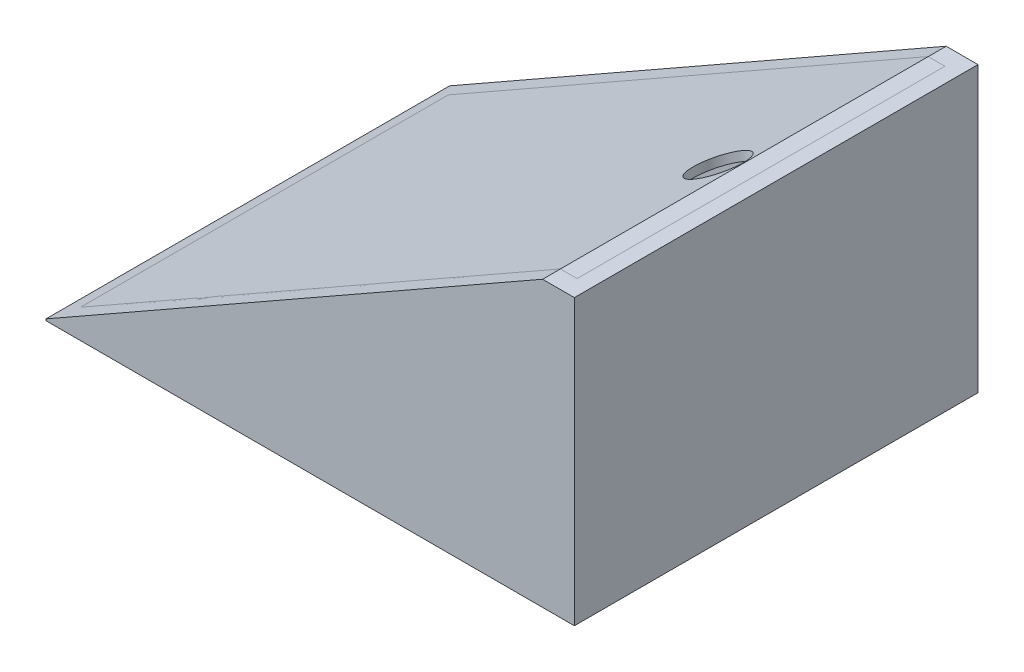
ISO-10303-21;
HEADER;
FILE_DESCRIPTION(('STEP AP214'),'2;1');
FILE_NAME('part.step','',(''),(''),'','','');
FILE_SCHEMA(('AUTOMOTIVE_DESIGN { 1 0 10303 214 1 1 1 1 }'));
ENDSEC;
DATA;
#1=APPLICATION_CONTEXT('core data for automotive mechanical design processes');
#2=APPLICATION_PROTOCOL_DEFINITION('international standard','automotive_design',2000,#1);
#3=PRODUCT_CONTEXT('',#1,'mechanical');
#4=PRODUCT('Part','Part','',(#3));
#5=PRODUCT_RELATED_PRODUCT_CATEGORY('part','',(#4));
#6=PRODUCT_DEFINITION_FORMATION('','',#4);
#7=PRODUCT_DEFINITION_CONTEXT('part definition',#1,'design');
#8=PRODUCT_DEFINITION('design','',#6,#7);
#9=PRODUCT_DEFINITION_SHAPE('','',#8);
#10=(LENGTH_UNIT() NAMED_UNIT(*) SI_UNIT(.MILLI.,.METRE.));
#11=(NAMED_UNIT(*) PLANE_ANGLE_UNIT() SI_UNIT($,.RADIAN.));
#12=(NAMED_UNIT(*) SI_UNIT($,.STERADIAN.) SOLID_ANGLE_UNIT());
#13=UNCERTAINTY_MEASURE_WITH_UNIT(LENGTH_MEASURE(1.E-05),#10,'distance_accuracy_value','');
#14=(GEOMETRIC_REPRESENTATION_CONTEXT(3) GLOBAL_UNCERTAINTY_ASSIGNED_CONTEXT((#13)) GLOBAL_UNIT_ASSIGNED_CONTEXT((#10,
#11,#12)) REPRESENTATION_CONTEXT('',''));
#15=CARTESIAN_POINT('',(0.,0.,0.));
#16=DIRECTION('',(0.,0.,1.));
#17=DIRECTION('',(1.,0.,0.));
#18=AXIS2_PLACEMENT_3D('',#15,#16,#17);
#19=CARTESIAN_POINT('',(-42.4496374602654,0.,70.2103839542302));
#20=DIRECTION('',(1.,0.,0.));
#21=DIRECTION('',(0.,0.,-1.));
#22=AXIS2_PLACEMENT_3D('',#19,#20,#21);
#23=PLANE('',#22);
#24=DIRECTION('',(0.,-1.,0.));
#25=VECTOR('',#24,1.);
#26=CARTESIAN_POINT('',(-42.4496374602654,0.,-10.7896160457699));
#27=LINE('',#26,#25);
#28=CARTESIAN_POINT('',(-42.4496374602654,2.4179577529253,-10.7896160457699));
#29=VERTEX_POINT('',#28);
#30=CARTESIAN_POINT('',(-42.4496374602654,0.,-10.7896160457699));
#31=VERTEX_POINT('',#30);
#32=EDGE_CURVE('E109',#29,#31,#27,.T.);
#33=ORIENTED_EDGE('',*,*,#32,.T.);
#34=DIRECTION('',(0.,0.,-1.));
#35=VECTOR('',#34,1.);
#36=CARTESIAN_POINT('',(-42.4496374602654,0.,70.2103839542302));
#37=LINE('',#36,#35);
#38=CARTESIAN_POINT('',(-42.4496374602654,0.,70.2103839542302));
#39=VERTEX_POINT('',#38);
#40=EDGE_CURVE('E12',#39,#31,#37,.T.);
#41=ORIENTED_EDGE('',*,*,#40,.F.);
#42=DIRECTION('',(0.,-1.,0.));
#43=VECTOR('',#42,1.);
#44=CARTESIAN_POINT('',(-42.4496374602654,0.,70.2103839542302));
#45=LINE('',#44,#43);
#46=CARTESIAN_POINT('',(-42.4496374602654,2.4179577529253,70.2103839542302));
#47=VERTEX_POINT('',#46);
#48=EDGE_CURVE('E96',#47,#39,#45,.T.);
#49=ORIENTED_EDGE('',*,*,#48,.F.);
#50=DIRECTION('',(0.,0.,-1.));
#51=VECTOR('',#50,1.);
#52=CARTESIAN_POINT('',(-42.4496374602654,2.4179577529253,70.2103839542302));
#53=LINE('',#52,#51);
#54=EDGE_CURVE('E105',#47,#29,#53,.T.);
#55=ORIENTED_EDGE('',*,*,#54,.T.);
#56=EDGE_LOOP('',(#33,#41,#49,#55));
#57=FACE_BOUND('',#56,.T.);
#58=ADVANCED_FACE('F44',(#57),#23,.F.);
#59=CARTESIAN_POINT('',(-42.4496374602654,0.,70.2103839542302));
#60=DIRECTION('',(-0.496708290503891,0.867917550314949,0.));
#61=DIRECTION('',(-0.867917550314949,-0.496708290503891,0.));
#62=AXIS2_PLACEMENT_3D('',#59,#60,#61);
#63=PLANE('',#62);
#64=CARTESIAN_POINT('',(56.5043619696953,56.6312685779229,29.3268806032643));
#65=DIRECTION('',(-0.496708290503891,0.867917550314949,0.));
#66=DIRECTION('',(-0.867917550314949,-0.496708290503891,0.));
#67=AXIS2_PLACEMENT_3D('',#64,#65,#66);
#68=ELLIPSE('',#67,6.25432199808688,5.42823582746047);
#69=CARTESIAN_POINT('',(51.0761261422348,53.5246949899922,29.3268806032643));
#70=VERTEX_POINT('',#69);
#71=EDGE_CURVE('E112',#70,#70,#68,.F.);
#72=ORIENTED_EDGE('',*,*,#71,.F.);
#73=EDGE_LOOP('',(#72));
#74=FACE_BOUND('',#73,.T.);
#75=DIRECTION('',(0.867917550314949,0.496708290503891,0.));
#76=VECTOR('',#75,1.);
#77=CARTESIAN_POINT('',(-42.4496374602654,0.,-10.7896160457699));
#78=LINE('',#77,#76);
#79=CARTESIAN_POINT('',(65.8853534152399,62.,-10.7896160457699));
#80=VERTEX_POINT('',#79);
#81=EDGE_CURVE('E100',#31,#80,#78,.T.);
#82=ORIENTED_EDGE('',*,*,#81,.T.);
#83=DIRECTION('',(0.,0.,-1.));
#84=VECTOR('',#83,1.);
#85=CARTESIAN_POINT('',(65.8853534152399,62.,70.2103839542302));
#86=LINE('',#85,#84);
#87=CARTESIAN_POINT('',(65.8853534152399,62.,70.2103839542302));
#88=VERTEX_POINT('',#87);
#89=EDGE_CURVE('E53',#88,#80,#86,.T.);
#90=ORIENTED_EDGE('',*,*,#89,.F.);
#91=DIRECTION('',(0.867917550314949,0.496708290503891,0.));
#92=VECTOR('',#91,1.);
#93=CARTESIAN_POINT('',(-42.4496374602654,0.,70.2103839542302));
#94=LINE('',#93,#92);
#95=EDGE_CURVE('E91',#39,#88,#94,.T.);
#96=ORIENTED_EDGE('',*,*,#95,.F.);
#97=ORIENTED_EDGE('',*,*,#40,.T.);
#98=EDGE_LOOP('',(#82,#90,#96,#97));
#99=FACE_BOUND('',#98,.T.);
#100=ADVANCED_FACE('F99',(#74,#99),#63,.F.);
#101=CARTESIAN_POINT('',(62.2453995556498,62.,70.2103839542302));
#102=DIRECTION('',(0.,-1.,0.));
#103=DIRECTION('',(0.,0.,-1.));
#104=AXIS2_PLACEMENT_3D('',#101,#102,#103);
#105=PLANE('',#104);
#106=DIRECTION('',(-1.,0.,0.));
#107=VECTOR('',#106,1.);
#108=CARTESIAN_POINT('',(62.2453995556498,62.,-10.7896160457699));
#109=LINE('',#108,#107);
#110=CARTESIAN_POINT('',(62.2453995556498,62.,-10.7896160457699));
#111=VERTEX_POINT('',#110);
#112=EDGE_CURVE('E78',#80,#111,#109,.T.);
#113=ORIENTED_EDGE('',*,*,#112,.T.);
#114=DIRECTION('',(0.,0.,-1.));
#115=VECTOR('',#114,1.);
#116=CARTESIAN_POINT('',(62.2453995556498,62.,70.2103839542302));
#117=LINE('',#116,#115);
#118=CARTESIAN_POINT('',(62.2453995556498,62.,70.2103839542302));
#119=VERTEX_POINT('',#118);
#120=EDGE_CURVE('E101',#119,#111,#117,.T.);
#121=ORIENTED_EDGE('',*,*,#120,.F.);
#122=DIRECTION('',(-1.,0.,0.));
#123=VECTOR('',#122,1.);
#124=CARTESIAN_POINT('',(62.2453995556498,62.,70.2103839542302));
#125=LINE('',#124,#123);
#126=EDGE_CURVE('E94',#88,#119,#125,.T.);
#127=ORIENTED_EDGE('',*,*,#126,.F.);
#128=ORIENTED_EDGE('',*,*,#89,.T.);
#129=EDGE_LOOP('',(#113,#121,#127,#128));
#130=FACE_BOUND('',#129,.T.);
#131=ADVANCED_FACE('F103',(#130),#105,.F.);
#132=CARTESIAN_POINT('',(-42.4496374602654,2.4179577529253,70.2103839542302));
#133=DIRECTION('',(0.494613150045348,-0.869113244521229,0.));
#134=DIRECTION('',(0.86911324452123,0.494613150045348,0.));
#135=AXIS2_PLACEMENT_3D('',#132,#133,#134);
#136=PLANE('',#135);
#137=CARTESIAN_POINT('',(56.5043619696953,58.7327702082346,29.3268806032643));
#138=DIRECTION('',(0.494613150045348,-0.869113244521229,0.));
#139=DIRECTION('',(-0.86911324452123,-0.494613150045348,0.));
#140=AXIS2_PLACEMENT_3D('',#137,#138,#139);
#141=ELLIPSE('',#140,6.24571753068926,5.42823582746047);
#142=CARTESIAN_POINT('',(51.0761261422348,55.6435561860869,29.3268806032643));
#143=VERTEX_POINT('',#142);
#144=EDGE_CURVE('E47',#143,#143,#141,.F.);
#145=ORIENTED_EDGE('',*,*,#144,.F.);
#146=EDGE_LOOP('',(#145));
#147=FACE_BOUND('',#146,.T.);
#148=DIRECTION('',(-0.86911324452123,-0.494613150045348,0.));
#149=VECTOR('',#148,1.);
#150=CARTESIAN_POINT('',(-42.4496374602654,2.4179577529253,-10.7896160457699));
#151=LINE('',#150,#149);
#152=EDGE_CURVE('E84',#111,#29,#151,.T.);
#153=ORIENTED_EDGE('',*,*,#152,.T.);
#154=ORIENTED_EDGE('',*,*,#54,.F.);
#155=DIRECTION('',(-0.86911324452123,-0.494613150045348,0.));
#156=VECTOR('',#155,1.);
#157=CARTESIAN_POINT('',(-42.4496374602654,2.4179577529253,70.2103839542302));
#158=LINE('',#157,#156);
#159=EDGE_CURVE('E61',#119,#47,#158,.T.);
#160=ORIENTED_EDGE('',*,*,#159,.F.);
#161=ORIENTED_EDGE('',*,*,#120,.T.);
#162=EDGE_LOOP('',(#153,#154,#160,#161));
#163=FACE_BOUND('',#162,.T.);
#164=ADVANCED_FACE('F117',(#147,#163),#136,.F.);
#165=CARTESIAN_POINT('',(0.,0.,70.2103839542302));
#166=DIRECTION('',(0.,0.,-1.));
#167=DIRECTION('',(-1.,0.,0.));
#168=AXIS2_PLACEMENT_3D('',#165,#166,#167);
#169=PLANE('',#168);
#170=ORIENTED_EDGE('',*,*,#48,.T.);
#171=ORIENTED_EDGE('',*,*,#95,.T.);
#172=ORIENTED_EDGE('',*,*,#126,.T.);
#173=ORIENTED_EDGE('',*,*,#159,.T.);
#174=EDGE_LOOP('',(#170,#171,#172,#173));
#175=FACE_BOUND('',#174,.T.);
#176=ADVANCED_FACE('F92',(#175),#169,.F.);
#177=CARTESIAN_POINT('',(0.,0.,-10.7896160457699));
#178=DIRECTION('',(0.,0.,-1.));
#179=DIRECTION('',(-1.,0.,0.));
#180=AXIS2_PLACEMENT_3D('',#177,#178,#179);
#181=PLANE('',#180);
#182=ORIENTED_EDGE('',*,*,#32,.F.);
#183=ORIENTED_EDGE('',*,*,#152,.F.);
#184=ORIENTED_EDGE('',*,*,#112,.F.);
#185=ORIENTED_EDGE('',*,*,#81,.F.);
#186=EDGE_LOOP('',(#182,#183,#184,#185));
#187=FACE_BOUND('',#186,.T.);
#188=ADVANCED_FACE('F120',(#187),#181,.T.);
#189=CARTESIAN_POINT('',(56.5043619696953,143.,29.3268806032643));
#190=DIRECTION('',(0.,-1.,0.));
#191=DIRECTION('',(0.,0.,-1.));
#192=AXIS2_PLACEMENT_3D('',#189,#190,#191);
#193=CYLINDRICAL_SURFACE('',#192,5.42823582746047);
#194=ORIENTED_EDGE('',*,*,#144,.T.);
#195=EDGE_LOOP('',(#194));
#196=FACE_BOUND('',#195,.T.);
#197=ORIENTED_EDGE('',*,*,#71,.T.);
#198=EDGE_LOOP('',(#197));
#199=FACE_BOUND('',#198,.T.);
#200=ADVANCED_FACE('F129',(#196,#199),#193,.F.);
#201=CLOSED_SHELL('',(#58,#100,#131,#164,#176,#188,#200));
#202=MANIFOLD_SOLID_BREP('B2',#201);
#203=CARTESIAN_POINT('',(0.,62.,0.));
#204=DIRECTION('',(0.,1.,0.));
#205=DIRECTION('',(0.,0.,1.));
#206=AXIS2_PLACEMENT_3D('',#203,#204,#205);
#207=PLANE('',#206);
#208=DIRECTION('',(0.,0.,1.));
#209=VECTOR('',#208,1.);
#210=CARTESIAN_POINT('',(62.2453995556498,62.,-150.78961604577));
#211=LINE('',#210,#209);
#212=CARTESIAN_POINT('',(62.2453995556498,62.,69.4433772522984));
#213=VERTEX_POINT('',#212);
#214=CARTESIAN_POINT('',(62.2453995556498,62.,73.3362640440305));
#215=VERTEX_POINT('',#214);
#216=EDGE_CURVE('E271',#213,#215,#211,.T.);
#217=ORIENTED_EDGE('',*,*,#216,.T.);
#218=DIRECTION('',(1.,0.,0.));
#219=VECTOR('',#218,1.);
#220=CARTESIAN_POINT('',(-46.0793803464981,62.,73.3362640440305));
#221=LINE('',#220,#219);
#222=CARTESIAN_POINT('',(69.1829483935749,62.,73.3362640440305));
#223=VERTEX_POINT('',#222);
#224=EDGE_CURVE('E291',#215,#223,#221,.T.);
#225=ORIENTED_EDGE('',*,*,#224,.T.);
#226=DIRECTION('',(0.,0.,-1.));
#227=VECTOR('',#226,1.);
#228=CARTESIAN_POINT('',(69.1829483935749,62.,-14.7130621335805));
#229=LINE('',#228,#227);
#230=CARTESIAN_POINT('',(69.1829483935749,62.,-14.7130621335805));
#231=VERTEX_POINT('',#230);
#232=EDGE_CURVE('E286',#223,#231,#229,.T.);
#233=ORIENTED_EDGE('',*,*,#232,.T.);
#234=DIRECTION('',(-1.,0.,0.));
#235=VECTOR('',#234,1.);
#236=CARTESIAN_POINT('',(-46.0793803464981,62.,-14.7130621335805));
#237=LINE('',#236,#235);
#238=CARTESIAN_POINT('',(62.2453995556498,62.,-14.7130621335805));
#239=VERTEX_POINT('',#238);
#240=EDGE_CURVE('E278',#231,#239,#237,.T.);
#241=ORIENTED_EDGE('',*,*,#240,.T.);
#242=CARTESIAN_POINT('',(62.2453995556498,62.,-10.7896160457699));
#243=VERTEX_POINT('',#242);
#244=EDGE_CURVE('E263',#239,#243,#211,.T.);
#245=ORIENTED_EDGE('',*,*,#244,.T.);
#246=DIRECTION('',(-1.,0.,0.));
#247=VECTOR('',#246,1.);
#248=CARTESIAN_POINT('',(-42.4496374602654,62.,-10.7896160457699));
#249=LINE('',#248,#247);
#250=CARTESIAN_POINT('',(65.8853534152399,62.,-10.7896160457699));
#251=VERTEX_POINT('',#250);
#252=EDGE_CURVE('E332',#251,#243,#249,.T.);
#253=ORIENTED_EDGE('',*,*,#252,.F.);
#254=DIRECTION('',(0.,0.,-1.));
#255=VECTOR('',#254,1.);
#256=CARTESIAN_POINT('',(65.8853534152399,62.,-10.7896160457699));
#257=LINE('',#256,#255);
#258=CARTESIAN_POINT('',(65.8853534152399,62.,69.4433772522984));
#259=VERTEX_POINT('',#258);
#260=EDGE_CURVE('E347',#259,#251,#257,.T.);
#261=ORIENTED_EDGE('',*,*,#260,.F.);
#262=DIRECTION('',(1.,0.,0.));
#263=VECTOR('',#262,1.);
#264=CARTESIAN_POINT('',(-42.4496374602654,62.,69.4433772522984));
#265=LINE('',#264,#263);
#266=EDGE_CURVE('E336',#213,#259,#265,.T.);
#267=ORIENTED_EDGE('',*,*,#266,.F.);
#268=EDGE_LOOP('',(#217,#225,#233,#241,#245,#253,#261,#267));
#269=FACE_BOUND('',#268,.T.);
#270=ADVANCED_FACE('F188',(#269),#207,.T.);
#271=CARTESIAN_POINT('',(0.,0.,0.));
#272=DIRECTION('',(0.,1.,0.));
#273=DIRECTION('',(0.,0.,1.));
#274=AXIS2_PLACEMENT_3D('',#271,#272,#273);
#275=PLANE('',#274);
#276=DIRECTION('',(0.,0.,1.));
#277=VECTOR('',#276,1.);
#278=CARTESIAN_POINT('',(-46.0793803464981,0.,-14.7130621335805));
#279=LINE('',#278,#277);
#280=CARTESIAN_POINT('',(-46.0793803464981,0.,-14.7130621335805));
#281=VERTEX_POINT('',#280);
#282=CARTESIAN_POINT('',(-46.0793803464981,0.,73.3362640440305));
#283=VERTEX_POINT('',#282);
#284=EDGE_CURVE('E295',#281,#283,#279,.T.);
#285=ORIENTED_EDGE('',*,*,#284,.F.);
#286=DIRECTION('',(-1.,0.,0.));
#287=VECTOR('',#286,1.);
#288=CARTESIAN_POINT('',(-46.0793803464981,0.,-14.7130621335805));
#289=LINE('',#288,#287);
#290=CARTESIAN_POINT('',(69.1829483935749,0.,-14.7130621335805));
#291=VERTEX_POINT('',#290);
#292=EDGE_CURVE('E303',#291,#281,#289,.T.);
#293=ORIENTED_EDGE('',*,*,#292,.F.);
#294=DIRECTION('',(0.,0.,-1.));
#295=VECTOR('',#294,1.);
#296=CARTESIAN_POINT('',(69.1829483935749,0.,-14.7130621335805));
#297=LINE('',#296,#295);
#298=CARTESIAN_POINT('',(69.1829483935749,0.,73.3362640440305));
#299=VERTEX_POINT('',#298);
#300=EDGE_CURVE('E301',#299,#291,#297,.T.);
#301=ORIENTED_EDGE('',*,*,#300,.F.);
#302=DIRECTION('',(1.,0.,0.));
#303=VECTOR('',#302,1.);
#304=CARTESIAN_POINT('',(-46.0793803464981,0.,73.3362640440305));
#305=LINE('',#304,#303);
#306=EDGE_CURVE('E298',#283,#299,#305,.T.);
#307=ORIENTED_EDGE('',*,*,#306,.F.);
#308=EDGE_LOOP('',(#285,#293,#301,#307));
#309=FACE_BOUND('',#308,.T.);
#310=DIRECTION('',(0.,0.,1.));
#311=VECTOR('',#310,1.);
#312=CARTESIAN_POINT('',(-42.4496374602654,0.,-10.7896160457699));
#313=LINE('',#312,#311);
#314=CARTESIAN_POINT('',(-42.4496374602654,0.,-10.7896160457699));
#315=VERTEX_POINT('',#314);
#316=CARTESIAN_POINT('',(-42.4496374602654,0.,69.4433772522984));
#317=VERTEX_POINT('',#316);
#318=EDGE_CURVE('E343',#315,#317,#313,.T.);
#319=ORIENTED_EDGE('',*,*,#318,.T.);
#320=DIRECTION('',(1.,0.,0.));
#321=VECTOR('',#320,1.);
#322=CARTESIAN_POINT('',(-42.4496374602654,0.,69.4433772522984));
#323=LINE('',#322,#321);
#324=CARTESIAN_POINT('',(65.8853534152399,0.,69.4433772522984));
#325=VERTEX_POINT('',#324);
#326=EDGE_CURVE('E340',#317,#325,#323,.T.);
#327=ORIENTED_EDGE('',*,*,#326,.T.);
#328=DIRECTION('',(0.,0.,-1.));
#329=VECTOR('',#328,1.);
#330=CARTESIAN_POINT('',(65.8853534152399,0.,-10.7896160457699));
#331=LINE('',#330,#329);
#332=CARTESIAN_POINT('',(65.8853534152399,0.,-10.7896160457699));
#333=VERTEX_POINT('',#332);
#334=EDGE_CURVE('E337',#325,#333,#331,.T.);
#335=ORIENTED_EDGE('',*,*,#334,.T.);
#336=DIRECTION('',(-1.,0.,0.));
#337=VECTOR('',#336,1.);
#338=CARTESIAN_POINT('',(-42.4496374602654,0.,-10.7896160457699));
#339=LINE('',#338,#337);
#340=EDGE_CURVE('E333',#333,#315,#339,.T.);
#341=ORIENTED_EDGE('',*,*,#340,.T.);
#342=EDGE_LOOP('',(#319,#327,#335,#341));
#343=FACE_BOUND('',#342,.T.);
#344=ADVANCED_FACE('F320',(#309,#343),#275,.F.);
#345=CARTESIAN_POINT('',(-46.0793803464981,62.,-14.7130621335805));
#346=DIRECTION('',(1.,0.,0.));
#347=DIRECTION('',(0.,0.,-1.));
#348=AXIS2_PLACEMENT_3D('',#345,#346,#347);
#349=PLANE('',#348);
#350=DIRECTION('',(0.,-1.,0.));
#351=VECTOR('',#350,1.);
#352=CARTESIAN_POINT('',(-46.0793803464981,62.,73.3362640440305));
#353=LINE('',#352,#351);
#354=CARTESIAN_POINT('',(-46.0793803464981,0.352267724460488,73.3362640440305));
#355=VERTEX_POINT('',#354);
#356=EDGE_CURVE('E196',#355,#283,#353,.T.);
#357=ORIENTED_EDGE('',*,*,#356,.F.);
#358=DIRECTION('',(0.,0.,-1.));
#359=VECTOR('',#358,1.);
#360=CARTESIAN_POINT('',(-46.0793803464981,0.352267724460488,-14.7130621335805));
#361=LINE('',#360,#359);
#362=CARTESIAN_POINT('',(-46.0793803464981,0.352267724460497,-14.7130621335805));
#363=VERTEX_POINT('',#362);
#364=EDGE_CURVE('E281',#355,#363,#361,.T.);
#365=ORIENTED_EDGE('',*,*,#364,.T.);
#366=DIRECTION('',(0.,-1.,0.));
#367=VECTOR('',#366,1.);
#368=CARTESIAN_POINT('',(-46.0793803464981,62.,-14.7130621335805));
#369=LINE('',#368,#367);
#370=EDGE_CURVE('E280',#363,#281,#369,.T.);
#371=ORIENTED_EDGE('',*,*,#370,.T.);
#372=ORIENTED_EDGE('',*,*,#284,.T.);
#373=EDGE_LOOP('',(#357,#365,#371,#372));
#374=FACE_BOUND('',#373,.T.);
#375=ADVANCED_FACE('F190',(#374),#349,.F.);
#376=CARTESIAN_POINT('',(-46.0793803464981,62.,73.3362640440305));
#377=DIRECTION('',(0.,0.,-1.));
#378=DIRECTION('',(-1.,0.,0.));
#379=AXIS2_PLACEMENT_3D('',#376,#377,#378);
#380=PLANE('',#379);
#381=ORIENTED_EDGE('',*,*,#224,.F.);
#382=DIRECTION('',(-0.86911324452123,-0.494613150045348,0.));
#383=VECTOR('',#382,1.);
#384=CARTESIAN_POINT('',(-19.5785713216892,15.4339026128248,73.3362640440305));
#385=LINE('',#384,#383);
#386=EDGE_CURVE('E315',#215,#355,#385,.T.);
#387=ORIENTED_EDGE('',*,*,#386,.T.);
#388=ORIENTED_EDGE('',*,*,#356,.T.);
#389=ORIENTED_EDGE('',*,*,#306,.T.);
#390=DIRECTION('',(0.,-1.,0.));
#391=VECTOR('',#390,1.);
#392=CARTESIAN_POINT('',(69.1829483935749,62.,73.3362640440305));
#393=LINE('',#392,#391);
#394=EDGE_CURVE('E306',#223,#299,#393,.T.);
#395=ORIENTED_EDGE('',*,*,#394,.F.);
#396=EDGE_LOOP('',(#381,#387,#388,#389,#395));
#397=FACE_BOUND('',#396,.T.);
#398=ADVANCED_FACE('F313',(#397),#380,.F.);
#399=CARTESIAN_POINT('',(69.1829483935749,62.,-14.7130621335805));
#400=DIRECTION('',(-1.,0.,0.));
#401=DIRECTION('',(0.,0.,1.));
#402=AXIS2_PLACEMENT_3D('',#399,#400,#401);
#403=PLANE('',#402);
#404=ORIENTED_EDGE('',*,*,#300,.T.);
#405=DIRECTION('',(0.,-1.,0.));
#406=VECTOR('',#405,1.);
#407=CARTESIAN_POINT('',(69.1829483935749,62.,-14.7130621335805));
#408=LINE('',#407,#406);
#409=EDGE_CURVE('E289',#231,#291,#408,.T.);
#410=ORIENTED_EDGE('',*,*,#409,.F.);
#411=ORIENTED_EDGE('',*,*,#232,.F.);
#412=ORIENTED_EDGE('',*,*,#394,.T.);
#413=EDGE_LOOP('',(#404,#410,#411,#412));
#414=FACE_BOUND('',#413,.T.);
#415=ADVANCED_FACE('F324',(#414),#403,.F.);
#416=CARTESIAN_POINT('',(-46.0793803464981,62.,-14.7130621335805));
#417=DIRECTION('',(0.,0.,1.));
#418=DIRECTION('',(1.,0.,0.));
#419=AXIS2_PLACEMENT_3D('',#416,#417,#418);
#420=PLANE('',#419);
#421=ORIENTED_EDGE('',*,*,#370,.F.);
#422=DIRECTION('',(0.86911324452123,0.494613150045348,0.));
#423=VECTOR('',#422,1.);
#424=CARTESIAN_POINT('',(-19.5785713216892,15.4339026128248,-14.7130621335805));
#425=LINE('',#424,#423);
#426=EDGE_CURVE('E266',#363,#239,#425,.T.);
#427=ORIENTED_EDGE('',*,*,#426,.T.);
#428=ORIENTED_EDGE('',*,*,#240,.F.);
#429=ORIENTED_EDGE('',*,*,#409,.T.);
#430=ORIENTED_EDGE('',*,*,#292,.T.);
#431=EDGE_LOOP('',(#421,#427,#428,#429,#430));
#432=FACE_BOUND('',#431,.T.);
#433=ADVANCED_FACE('F276',(#432),#420,.F.);
#434=CARTESIAN_POINT('',(-42.4496374602654,62.,-10.7896160457699));
#435=DIRECTION('',(1.,0.,0.));
#436=DIRECTION('',(0.,0.,-1.));
#437=AXIS2_PLACEMENT_3D('',#434,#435,#436);
#438=PLANE('',#437);
#439=DIRECTION('',(0.,0.,-1.));
#440=VECTOR('',#439,1.);
#441=CARTESIAN_POINT('',(-42.4496374602654,2.41795775292531,-10.7896160457699));
#442=LINE('',#441,#440);
#443=CARTESIAN_POINT('',(-42.4496374602654,2.41795775292531,69.4433772522984));
#444=VERTEX_POINT('',#443);
#445=CARTESIAN_POINT('',(-42.4496374602654,2.41795775292533,-10.7896160457699));
#446=VERTEX_POINT('',#445);
#447=EDGE_CURVE('E202',#444,#446,#442,.T.);
#448=ORIENTED_EDGE('',*,*,#447,.F.);
#449=DIRECTION('',(0.,-1.,0.));
#450=VECTOR('',#449,1.);
#451=CARTESIAN_POINT('',(-42.4496374602654,62.,69.4433772522984));
#452=LINE('',#451,#450);
#453=EDGE_CURVE('E299',#444,#317,#452,.T.);
#454=ORIENTED_EDGE('',*,*,#453,.T.);
#455=ORIENTED_EDGE('',*,*,#318,.F.);
#456=DIRECTION('',(0.,-1.,0.));
#457=VECTOR('',#456,1.);
#458=CARTESIAN_POINT('',(-42.4496374602654,62.,-10.7896160457699));
#459=LINE('',#458,#457);
#460=EDGE_CURVE('E330',#446,#315,#459,.T.);
#461=ORIENTED_EDGE('',*,*,#460,.F.);
#462=EDGE_LOOP('',(#448,#454,#455,#461));
#463=FACE_BOUND('',#462,.T.);
#464=ADVANCED_FACE('F363',(#463),#438,.T.);
#465=CARTESIAN_POINT('',(-42.4496374602654,62.,69.4433772522984));
#466=DIRECTION('',(0.,0.,-1.));
#467=DIRECTION('',(-1.,0.,0.));
#468=AXIS2_PLACEMENT_3D('',#465,#466,#467);
#469=PLANE('',#468);
#470=DIRECTION('',(-0.86911324452123,-0.494613150045348,0.));
#471=VECTOR('',#470,1.);
#472=CARTESIAN_POINT('',(-16.8368166051449,16.9942377539015,69.4433772522984));
#473=LINE('',#472,#471);
#474=EDGE_CURVE('E282',#213,#444,#473,.T.);
#475=ORIENTED_EDGE('',*,*,#474,.F.);
#476=ORIENTED_EDGE('',*,*,#266,.T.);
#477=DIRECTION('',(0.,-1.,0.));
#478=VECTOR('',#477,1.);
#479=CARTESIAN_POINT('',(65.8853534152399,62.,69.4433772522984));
#480=LINE('',#479,#478);
#481=EDGE_CURVE('E327',#259,#325,#480,.T.);
#482=ORIENTED_EDGE('',*,*,#481,.T.);
#483=ORIENTED_EDGE('',*,*,#326,.F.);
#484=ORIENTED_EDGE('',*,*,#453,.F.);
#485=EDGE_LOOP('',(#475,#476,#482,#483,#484));
#486=FACE_BOUND('',#485,.T.);
#487=ADVANCED_FACE('F358',(#486),#469,.T.);
#488=CARTESIAN_POINT('',(65.8853534152399,62.,-10.7896160457699));
#489=DIRECTION('',(-1.,0.,0.));
#490=DIRECTION('',(0.,0.,1.));
#491=AXIS2_PLACEMENT_3D('',#488,#489,#490);
#492=PLANE('',#491);
#493=ORIENTED_EDGE('',*,*,#334,.F.);
#494=ORIENTED_EDGE('',*,*,#481,.F.);
#495=ORIENTED_EDGE('',*,*,#260,.T.);
#496=DIRECTION('',(0.,-1.,0.));
#497=VECTOR('',#496,1.);
#498=CARTESIAN_POINT('',(65.8853534152399,62.,-10.7896160457699));
#499=LINE('',#498,#497);
#500=EDGE_CURVE('E210',#251,#333,#499,.T.);
#501=ORIENTED_EDGE('',*,*,#500,.T.);
#502=EDGE_LOOP('',(#493,#494,#495,#501));
#503=FACE_BOUND('',#502,.T.);
#504=ADVANCED_FACE('F368',(#503),#492,.T.);
#505=CARTESIAN_POINT('',(-42.4496374602654,62.,-10.7896160457699));
#506=DIRECTION('',(0.,0.,1.));
#507=DIRECTION('',(1.,0.,0.));
#508=AXIS2_PLACEMENT_3D('',#505,#506,#507);
#509=PLANE('',#508);
#510=DIRECTION('',(0.86911324452123,0.494613150045348,0.));
#511=VECTOR('',#510,1.);
#512=CARTESIAN_POINT('',(-16.8368166051449,16.9942377539015,-10.7896160457699));
#513=LINE('',#512,#511);
#514=EDGE_CURVE('E42',#446,#243,#513,.T.);
#515=ORIENTED_EDGE('',*,*,#514,.F.);
#516=ORIENTED_EDGE('',*,*,#460,.T.);
#517=ORIENTED_EDGE('',*,*,#340,.F.);
#518=ORIENTED_EDGE('',*,*,#500,.F.);
#519=ORIENTED_EDGE('',*,*,#252,.T.);
#520=EDGE_LOOP('',(#515,#516,#517,#518,#519));
#521=FACE_BOUND('',#520,.T.);
#522=ADVANCED_FACE('F365',(#521),#509,.T.);
#523=CARTESIAN_POINT('',(62.2453995556498,62.,-150.78961604577));
#524=DIRECTION('',(0.494613150045348,-0.86911324452123,0.));
#525=DIRECTION('',(0.86911324452123,0.494613150045348,0.));
#526=AXIS2_PLACEMENT_3D('',#523,#524,#525);
#527=PLANE('',#526);
#528=ORIENTED_EDGE('',*,*,#216,.F.);
#529=ORIENTED_EDGE('',*,*,#474,.T.);
#530=ORIENTED_EDGE('',*,*,#447,.T.);
#531=ORIENTED_EDGE('',*,*,#514,.T.);
#532=ORIENTED_EDGE('',*,*,#244,.F.);
#533=ORIENTED_EDGE('',*,*,#426,.F.);
#534=ORIENTED_EDGE('',*,*,#364,.F.);
#535=ORIENTED_EDGE('',*,*,#386,.F.);
#536=EDGE_LOOP('',(#528,#529,#530,#531,#532,#533,#534,#535));
#537=FACE_BOUND('',#536,.T.);
#538=ADVANCED_FACE('F265',(#537),#527,.F.);
#539=CLOSED_SHELL('',(#270,#344,#375,#398,#415,#433,#464,#487,#504,#522,#538));
#540=MANIFOLD_SOLID_BREP('B6',#539);
#541=ADVANCED_BREP_SHAPE_REPRESENTATION('',(#18,#202,#540),#14);
#542=SHAPE_DEFINITION_REPRESENTATION(#9,#541);
ENDSEC;
END-ISO-10303-21;
